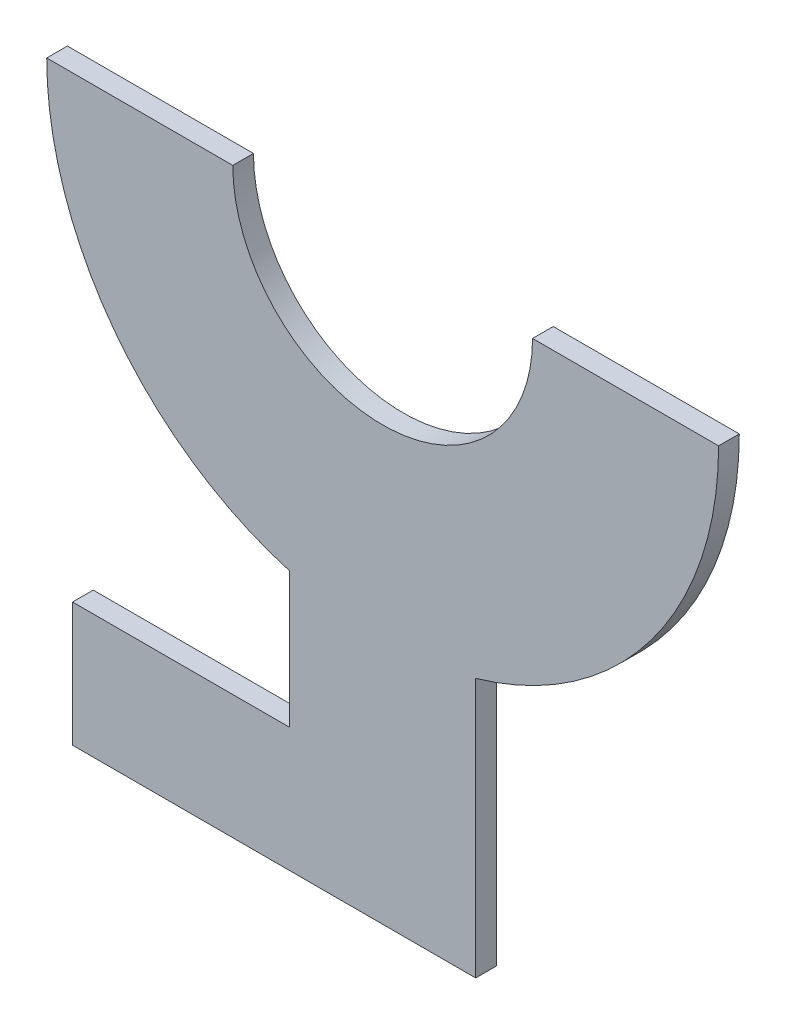
ISO-10303-21;
HEADER;
FILE_DESCRIPTION(('STEP AP214'),'2;1');
FILE_NAME('part.step','',(''),(''),'','','');
FILE_SCHEMA(('AUTOMOTIVE_DESIGN { 1 0 10303 214 1 1 1 1 }'));
ENDSEC;
DATA;
#1=APPLICATION_CONTEXT('core data for automotive mechanical design processes');
#2=APPLICATION_PROTOCOL_DEFINITION('international standard','automotive_design',2000,#1);
#3=PRODUCT_CONTEXT('',#1,'mechanical');
#4=PRODUCT('Part','Part','',(#3));
#5=PRODUCT_RELATED_PRODUCT_CATEGORY('part','',(#4));
#6=PRODUCT_DEFINITION_FORMATION('','',#4);
#7=PRODUCT_DEFINITION_CONTEXT('part definition',#1,'design');
#8=PRODUCT_DEFINITION('design','',#6,#7);
#9=PRODUCT_DEFINITION_SHAPE('','',#8);
#10=(LENGTH_UNIT() NAMED_UNIT(*) SI_UNIT(.MILLI.,.METRE.));
#11=(NAMED_UNIT(*) PLANE_ANGLE_UNIT() SI_UNIT($,.RADIAN.));
#12=(NAMED_UNIT(*) SI_UNIT($,.STERADIAN.) SOLID_ANGLE_UNIT());
#13=UNCERTAINTY_MEASURE_WITH_UNIT(LENGTH_MEASURE(1.E-05),#10,'distance_accuracy_value','');
#14=(GEOMETRIC_REPRESENTATION_CONTEXT(3) GLOBAL_UNCERTAINTY_ASSIGNED_CONTEXT((#13)) GLOBAL_UNIT_ASSIGNED_CONTEXT((#10,
#11,#12)) REPRESENTATION_CONTEXT('',''));
#15=CARTESIAN_POINT('',(0.,0.,0.));
#16=DIRECTION('',(0.,0.,1.));
#17=DIRECTION('',(1.,0.,0.));
#18=AXIS2_PLACEMENT_3D('',#15,#16,#17);
#19=CARTESIAN_POINT('',(-0.03924178240525,0.536150599791,0.02));
#20=DIRECTION('',(0.,0.,1.));
#21=DIRECTION('',(1.,0.,0.));
#22=AXIS2_PLACEMENT_3D('',#19,#20,#21);
#23=PLANE('',#22);
#24=CARTESIAN_POINT('',(0.,0.799314004839,0.02));
#25=DIRECTION('',(0.,0.,1.));
#26=DIRECTION('',(1.,0.,0.));
#27=AXIS2_PLACEMENT_3D('',#24,#25,#26);
#28=CIRCLE('',#27,0.325);
#29=CARTESIAN_POINT('',(-0.325,0.799314,0.02));
#30=VERTEX_POINT('',#29);
#31=CARTESIAN_POINT('',(-0.09,0.487024075446,0.02));
#32=VERTEX_POINT('',#31);
#33=EDGE_CURVE('E319',#30,#32,#28,.T.);
#34=ORIENTED_EDGE('',*,*,#33,.T.);
#35=DIRECTION('',(0.,1.,0.));
#36=VECTOR('',#35,1.);
#37=CARTESIAN_POINT('',(-0.09,0.356,0.02));
#38=LINE('',#37,#36);
#39=CARTESIAN_POINT('',(-0.09,0.356,0.02));
#40=VERTEX_POINT('',#39);
#41=EDGE_CURVE('E344',#40,#32,#38,.T.);
#42=ORIENTED_EDGE('',*,*,#41,.F.);
#43=DIRECTION('',(-1.,0.,0.));
#44=VECTOR('',#43,1.);
#45=CARTESIAN_POINT('',(-0.09,0.356,0.02));
#46=LINE('',#45,#44);
#47=CARTESIAN_POINT('',(-0.3,0.356,0.02));
#48=VERTEX_POINT('',#47);
#49=EDGE_CURVE('E352',#40,#48,#46,.T.);
#50=ORIENTED_EDGE('',*,*,#49,.T.);
#51=DIRECTION('',(0.,-1.,0.));
#52=VECTOR('',#51,1.);
#53=CARTESIAN_POINT('',(-0.3,0.356,0.02));
#54=LINE('',#53,#52);
#55=CARTESIAN_POINT('',(-0.3,0.236,0.02));
#56=VERTEX_POINT('',#55);
#57=EDGE_CURVE('E137',#48,#56,#54,.T.);
#58=ORIENTED_EDGE('',*,*,#57,.T.);
#59=DIRECTION('',(1.,0.,0.));
#60=VECTOR('',#59,1.);
#61=CARTESIAN_POINT('',(-0.3,0.236,0.02));
#62=LINE('',#61,#60);
#63=CARTESIAN_POINT('',(0.09,0.236,0.02));
#64=VERTEX_POINT('',#63);
#65=EDGE_CURVE('E134',#56,#64,#62,.T.);
#66=ORIENTED_EDGE('',*,*,#65,.T.);
#67=DIRECTION('',(0.,-1.,0.));
#68=VECTOR('',#67,1.);
#69=CARTESIAN_POINT('',(0.09,0.487024075446,0.02));
#70=LINE('',#69,#68);
#71=CARTESIAN_POINT('',(0.09,0.487024075446,0.02));
#72=VERTEX_POINT('',#71);
#73=EDGE_CURVE('E119',#72,#64,#70,.T.);
#74=ORIENTED_EDGE('',*,*,#73,.F.);
#75=CARTESIAN_POINT('',(0.,0.799314004839,0.02));
#76=DIRECTION('',(0.,0.,1.));
#77=DIRECTION('',(1.,0.,0.));
#78=AXIS2_PLACEMENT_3D('',#75,#76,#77);
#79=CIRCLE('',#78,0.325);
#80=CARTESIAN_POINT('',(0.325,0.799314,0.02));
#81=VERTEX_POINT('',#80);
#82=EDGE_CURVE('E164',#72,#81,#79,.T.);
#83=ORIENTED_EDGE('',*,*,#82,.T.);
#84=DIRECTION('',(-1.,0.,0.));
#85=VECTOR('',#84,1.);
#86=CARTESIAN_POINT('',(0.325,0.799314,0.02));
#87=LINE('',#86,#85);
#88=CARTESIAN_POINT('',(0.145,0.799314,0.02));
#89=VERTEX_POINT('',#88);
#90=EDGE_CURVE('E175',#81,#89,#87,.T.);
#91=ORIENTED_EDGE('',*,*,#90,.T.);
#92=CARTESIAN_POINT('',(0.,0.799314004839,0.02));
#93=DIRECTION('',(0.,0.,1.));
#94=DIRECTION('',(1.,0.,0.));
#95=AXIS2_PLACEMENT_3D('',#92,#93,#94);
#96=CIRCLE('',#95,0.145);
#97=CARTESIAN_POINT('',(-0.145,0.799314,0.02));
#98=VERTEX_POINT('',#97);
#99=EDGE_CURVE('E180',#98,#89,#96,.T.);
#100=ORIENTED_EDGE('',*,*,#99,.F.);
#101=DIRECTION('',(1.,0.,0.));
#102=VECTOR('',#101,1.);
#103=CARTESIAN_POINT('',(-0.325,0.799314,0.02));
#104=LINE('',#103,#102);
#105=EDGE_CURVE('E20',#30,#98,#104,.T.);
#106=ORIENTED_EDGE('',*,*,#105,.F.);
#107=EDGE_LOOP('',(#34,#42,#50,#58,#66,#74,#83,#91,#100,#106));
#108=FACE_BOUND('',#107,.T.);
#109=ADVANCED_FACE('F17',(#108),#23,.T.);
#110=CARTESIAN_POINT('',(-0.03924178240525,0.536150599791,0.));
#111=DIRECTION('',(0.,0.,1.));
#112=DIRECTION('',(1.,0.,0.));
#113=AXIS2_PLACEMENT_3D('',#110,#111,#112);
#114=PLANE('',#113);
#115=CARTESIAN_POINT('',(0.,0.799314004839,0.));
#116=DIRECTION('',(0.,0.,1.));
#117=DIRECTION('',(1.,0.,0.));
#118=AXIS2_PLACEMENT_3D('',#115,#116,#117);
#119=CIRCLE('',#118,0.325);
#120=CARTESIAN_POINT('',(-0.325,0.799314,0.));
#121=VERTEX_POINT('',#120);
#122=CARTESIAN_POINT('',(-0.09,0.487024075446,0.));
#123=VERTEX_POINT('',#122);
#124=EDGE_CURVE('E308',#121,#123,#119,.T.);
#125=ORIENTED_EDGE('',*,*,#124,.F.);
#126=DIRECTION('',(1.,0.,0.));
#127=VECTOR('',#126,1.);
#128=CARTESIAN_POINT('',(-0.325,0.799314,0.));
#129=LINE('',#128,#127);
#130=CARTESIAN_POINT('',(-0.145,0.799314,0.));
#131=VERTEX_POINT('',#130);
#132=EDGE_CURVE('E11',#121,#131,#129,.T.);
#133=ORIENTED_EDGE('',*,*,#132,.T.);
#134=CARTESIAN_POINT('',(0.,0.799314004839,0.));
#135=DIRECTION('',(0.,0.,1.));
#136=DIRECTION('',(1.,0.,0.));
#137=AXIS2_PLACEMENT_3D('',#134,#135,#136);
#138=CIRCLE('',#137,0.145);
#139=CARTESIAN_POINT('',(0.145,0.799314,0.));
#140=VERTEX_POINT('',#139);
#141=EDGE_CURVE('E183',#131,#140,#138,.T.);
#142=ORIENTED_EDGE('',*,*,#141,.T.);
#143=DIRECTION('',(-1.,0.,0.));
#144=VECTOR('',#143,1.);
#145=CARTESIAN_POINT('',(0.325,0.799314,0.));
#146=LINE('',#145,#144);
#147=CARTESIAN_POINT('',(0.325,0.799314,0.));
#148=VERTEX_POINT('',#147);
#149=EDGE_CURVE('E167',#148,#140,#146,.T.);
#150=ORIENTED_EDGE('',*,*,#149,.F.);
#151=CARTESIAN_POINT('',(0.,0.799314004839,0.));
#152=DIRECTION('',(0.,0.,1.));
#153=DIRECTION('',(1.,0.,0.));
#154=AXIS2_PLACEMENT_3D('',#151,#152,#153);
#155=CIRCLE('',#154,0.325);
#156=CARTESIAN_POINT('',(0.09,0.487024075446,0.));
#157=VERTEX_POINT('',#156);
#158=EDGE_CURVE('E156',#157,#148,#155,.T.);
#159=ORIENTED_EDGE('',*,*,#158,.F.);
#160=DIRECTION('',(0.,-1.,0.));
#161=VECTOR('',#160,1.);
#162=CARTESIAN_POINT('',(0.09,0.487024075446,0.));
#163=LINE('',#162,#161);
#164=CARTESIAN_POINT('',(0.09,0.236,0.));
#165=VERTEX_POINT('',#164);
#166=EDGE_CURVE('E131',#157,#165,#163,.T.);
#167=ORIENTED_EDGE('',*,*,#166,.T.);
#168=DIRECTION('',(1.,0.,0.));
#169=VECTOR('',#168,1.);
#170=CARTESIAN_POINT('',(-0.3,0.236,0.));
#171=LINE('',#170,#169);
#172=CARTESIAN_POINT('',(-0.3,0.236,0.));
#173=VERTEX_POINT('',#172);
#174=EDGE_CURVE('E144',#173,#165,#171,.T.);
#175=ORIENTED_EDGE('',*,*,#174,.F.);
#176=DIRECTION('',(0.,-1.,0.));
#177=VECTOR('',#176,1.);
#178=CARTESIAN_POINT('',(-0.3,0.356,0.));
#179=LINE('',#178,#177);
#180=CARTESIAN_POINT('',(-0.3,0.356,0.));
#181=VERTEX_POINT('',#180);
#182=EDGE_CURVE('E330',#181,#173,#179,.T.);
#183=ORIENTED_EDGE('',*,*,#182,.F.);
#184=DIRECTION('',(-1.,0.,0.));
#185=VECTOR('',#184,1.);
#186=CARTESIAN_POINT('',(-0.09,0.356,0.));
#187=LINE('',#186,#185);
#188=CARTESIAN_POINT('',(-0.09,0.356,0.));
#189=VERTEX_POINT('',#188);
#190=EDGE_CURVE('E343',#189,#181,#187,.T.);
#191=ORIENTED_EDGE('',*,*,#190,.F.);
#192=DIRECTION('',(0.,1.,0.));
#193=VECTOR('',#192,1.);
#194=CARTESIAN_POINT('',(-0.09,0.356,0.));
#195=LINE('',#194,#193);
#196=EDGE_CURVE('E311',#189,#123,#195,.T.);
#197=ORIENTED_EDGE('',*,*,#196,.T.);
#198=EDGE_LOOP('',(#125,#133,#142,#150,#159,#167,#175,#183,#191,#197));
#199=FACE_BOUND('',#198,.T.);
#200=ADVANCED_FACE('F276',(#199),#114,.F.);
#201=CARTESIAN_POINT('',(-0.325,0.799314,0.));
#202=DIRECTION('',(0.,1.,0.));
#203=DIRECTION('',(1.,0.,0.));
#204=AXIS2_PLACEMENT_3D('',#201,#202,#203);
#205=PLANE('',#204);
#206=DIRECTION('',(0.,0.,1.));
#207=VECTOR('',#206,1.);
#208=CARTESIAN_POINT('',(-0.325,0.799314,0.));
#209=LINE('',#208,#207);
#210=EDGE_CURVE('E316',#121,#30,#209,.T.);
#211=ORIENTED_EDGE('',*,*,#210,.T.);
#212=ORIENTED_EDGE('',*,*,#105,.T.);
#213=DIRECTION('',(0.,0.,1.));
#214=VECTOR('',#213,1.);
#215=CARTESIAN_POINT('',(-0.145,0.799314,0.));
#216=LINE('',#215,#214);
#217=EDGE_CURVE('E179',#131,#98,#216,.T.);
#218=ORIENTED_EDGE('',*,*,#217,.F.);
#219=ORIENTED_EDGE('',*,*,#132,.F.);
#220=EDGE_LOOP('',(#211,#212,#218,#219));
#221=FACE_BOUND('',#220,.T.);
#222=ADVANCED_FACE('F199',(#221),#205,.T.);
#223=CARTESIAN_POINT('',(0.,0.799314004839,0.));
#224=DIRECTION('',(0.,0.,-1.));
#225=DIRECTION('',(1.,0.,0.));
#226=AXIS2_PLACEMENT_3D('',#223,#224,#225);
#227=CYLINDRICAL_SURFACE('',#226,0.145);
#228=ORIENTED_EDGE('',*,*,#217,.T.);
#229=ORIENTED_EDGE('',*,*,#99,.T.);
#230=DIRECTION('',(0.,0.,1.));
#231=VECTOR('',#230,1.);
#232=CARTESIAN_POINT('',(0.145,0.799314,0.));
#233=LINE('',#232,#231);
#234=EDGE_CURVE('E171',#140,#89,#233,.T.);
#235=ORIENTED_EDGE('',*,*,#234,.F.);
#236=ORIENTED_EDGE('',*,*,#141,.F.);
#237=EDGE_LOOP('',(#228,#229,#235,#236));
#238=FACE_BOUND('',#237,.T.);
#239=ADVANCED_FACE('F193',(#238),#227,.F.);
#240=CARTESIAN_POINT('',(0.325,0.799314,0.));
#241=DIRECTION('',(0.,-1.,0.));
#242=DIRECTION('',(0.,0.,-1.));
#243=AXIS2_PLACEMENT_3D('',#240,#241,#242);
#244=PLANE('',#243);
#245=DIRECTION('',(0.,0.,1.));
#246=VECTOR('',#245,1.);
#247=CARTESIAN_POINT('',(0.325,0.799314,0.));
#248=LINE('',#247,#246);
#249=EDGE_CURVE('E160',#148,#81,#248,.T.);
#250=ORIENTED_EDGE('',*,*,#249,.F.);
#251=ORIENTED_EDGE('',*,*,#149,.T.);
#252=ORIENTED_EDGE('',*,*,#234,.T.);
#253=ORIENTED_EDGE('',*,*,#90,.F.);
#254=EDGE_LOOP('',(#250,#251,#252,#253));
#255=FACE_BOUND('',#254,.T.);
#256=ADVANCED_FACE('F198',(#255),#244,.F.);
#257=CARTESIAN_POINT('',(0.,0.799314004839,0.));
#258=DIRECTION('',(0.,0.,-1.));
#259=DIRECTION('',(1.,0.,0.));
#260=AXIS2_PLACEMENT_3D('',#257,#258,#259);
#261=CYLINDRICAL_SURFACE('',#260,0.325);
#262=DIRECTION('',(0.,0.,1.));
#263=VECTOR('',#262,1.);
#264=CARTESIAN_POINT('',(0.09,0.487024075446,0.));
#265=LINE('',#264,#263);
#266=EDGE_CURVE('E127',#157,#72,#265,.T.);
#267=ORIENTED_EDGE('',*,*,#266,.F.);
#268=ORIENTED_EDGE('',*,*,#158,.T.);
#269=ORIENTED_EDGE('',*,*,#249,.T.);
#270=ORIENTED_EDGE('',*,*,#82,.F.);
#271=EDGE_LOOP('',(#267,#268,#269,#270));
#272=FACE_BOUND('',#271,.T.);
#273=ADVANCED_FACE('F222',(#272),#261,.T.);
#274=CARTESIAN_POINT('',(0.09,0.487024075446,0.));
#275=DIRECTION('',(1.,0.,0.));
#276=DIRECTION('',(0.,1.,0.));
#277=AXIS2_PLACEMENT_3D('',#274,#275,#276);
#278=PLANE('',#277);
#279=ORIENTED_EDGE('',*,*,#266,.T.);
#280=ORIENTED_EDGE('',*,*,#73,.T.);
#281=DIRECTION('',(0.,0.,1.));
#282=VECTOR('',#281,1.);
#283=CARTESIAN_POINT('',(0.09,0.236,0.));
#284=LINE('',#283,#282);
#285=EDGE_CURVE('E124',#165,#64,#284,.T.);
#286=ORIENTED_EDGE('',*,*,#285,.F.);
#287=ORIENTED_EDGE('',*,*,#166,.F.);
#288=EDGE_LOOP('',(#279,#280,#286,#287));
#289=FACE_BOUND('',#288,.T.);
#290=ADVANCED_FACE('F121',(#289),#278,.T.);
#291=CARTESIAN_POINT('',(-0.3,0.236,0.));
#292=DIRECTION('',(0.,1.,0.));
#293=DIRECTION('',(1.,0.,0.));
#294=AXIS2_PLACEMENT_3D('',#291,#292,#293);
#295=PLANE('',#294);
#296=DIRECTION('',(0.,0.,1.));
#297=VECTOR('',#296,1.);
#298=CARTESIAN_POINT('',(-0.3,0.236,0.));
#299=LINE('',#298,#297);
#300=EDGE_CURVE('E329',#173,#56,#299,.T.);
#301=ORIENTED_EDGE('',*,*,#300,.F.);
#302=ORIENTED_EDGE('',*,*,#174,.T.);
#303=ORIENTED_EDGE('',*,*,#285,.T.);
#304=ORIENTED_EDGE('',*,*,#65,.F.);
#305=EDGE_LOOP('',(#301,#302,#303,#304));
#306=FACE_BOUND('',#305,.T.);
#307=ADVANCED_FACE('F143',(#306),#295,.F.);
#308=CARTESIAN_POINT('',(-0.3,0.356,0.));
#309=DIRECTION('',(1.,0.,0.));
#310=DIRECTION('',(0.,1.,0.));
#311=AXIS2_PLACEMENT_3D('',#308,#309,#310);
#312=PLANE('',#311);
#313=DIRECTION('',(0.,0.,1.));
#314=VECTOR('',#313,1.);
#315=CARTESIAN_POINT('',(-0.3,0.356,0.));
#316=LINE('',#315,#314);
#317=EDGE_CURVE('E348',#181,#48,#316,.T.);
#318=ORIENTED_EDGE('',*,*,#317,.F.);
#319=ORIENTED_EDGE('',*,*,#182,.T.);
#320=ORIENTED_EDGE('',*,*,#300,.T.);
#321=ORIENTED_EDGE('',*,*,#57,.F.);
#322=EDGE_LOOP('',(#318,#319,#320,#321));
#323=FACE_BOUND('',#322,.T.);
#324=ADVANCED_FACE('F240',(#323),#312,.F.);
#325=CARTESIAN_POINT('',(-0.09,0.356,0.));
#326=DIRECTION('',(0.,-1.,0.));
#327=DIRECTION('',(0.,0.,-1.));
#328=AXIS2_PLACEMENT_3D('',#325,#326,#327);
#329=PLANE('',#328);
#330=DIRECTION('',(0.,0.,1.));
#331=VECTOR('',#330,1.);
#332=CARTESIAN_POINT('',(-0.09,0.356,0.));
#333=LINE('',#332,#331);
#334=EDGE_CURVE('E327',#189,#40,#333,.T.);
#335=ORIENTED_EDGE('',*,*,#334,.F.);
#336=ORIENTED_EDGE('',*,*,#190,.T.);
#337=ORIENTED_EDGE('',*,*,#317,.T.);
#338=ORIENTED_EDGE('',*,*,#49,.F.);
#339=EDGE_LOOP('',(#335,#336,#337,#338));
#340=FACE_BOUND('',#339,.T.);
#341=ADVANCED_FACE('F231',(#340),#329,.F.);
#342=CARTESIAN_POINT('',(-0.09,0.356,0.));
#343=DIRECTION('',(-1.,0.,0.));
#344=DIRECTION('',(0.,0.,1.));
#345=AXIS2_PLACEMENT_3D('',#342,#343,#344);
#346=PLANE('',#345);
#347=ORIENTED_EDGE('',*,*,#334,.T.);
#348=ORIENTED_EDGE('',*,*,#41,.T.);
#349=DIRECTION('',(0.,0.,1.));
#350=VECTOR('',#349,1.);
#351=CARTESIAN_POINT('',(-0.09,0.487024075446,0.));
#352=LINE('',#351,#350);
#353=EDGE_CURVE('E315',#123,#32,#352,.T.);
#354=ORIENTED_EDGE('',*,*,#353,.F.);
#355=ORIENTED_EDGE('',*,*,#196,.F.);
#356=EDGE_LOOP('',(#347,#348,#354,#355));
#357=FACE_BOUND('',#356,.T.);
#358=ADVANCED_FACE('F212',(#357),#346,.T.);
#359=CARTESIAN_POINT('',(0.,0.799314004839,0.));
#360=DIRECTION('',(0.,0.,-1.));
#361=DIRECTION('',(1.,0.,0.));
#362=AXIS2_PLACEMENT_3D('',#359,#360,#361);
#363=CYLINDRICAL_SURFACE('',#362,0.325);
#364=ORIENTED_EDGE('',*,*,#210,.F.);
#365=ORIENTED_EDGE('',*,*,#124,.T.);
#366=ORIENTED_EDGE('',*,*,#353,.T.);
#367=ORIENTED_EDGE('',*,*,#33,.F.);
#368=EDGE_LOOP('',(#364,#365,#366,#367));
#369=FACE_BOUND('',#368,.T.);
#370=ADVANCED_FACE('F207',(#369),#363,.T.);
#371=CLOSED_SHELL('',(#109,#200,#222,#239,#256,#273,#290,#307,#324,#341,#358,#370));
#372=MANIFOLD_SOLID_BREP('B1',#371);
#373=ADVANCED_BREP_SHAPE_REPRESENTATION('',(#18,#372),#14);
#374=SHAPE_DEFINITION_REPRESENTATION(#9,#373);
ENDSEC;
END-ISO-10303-21;
